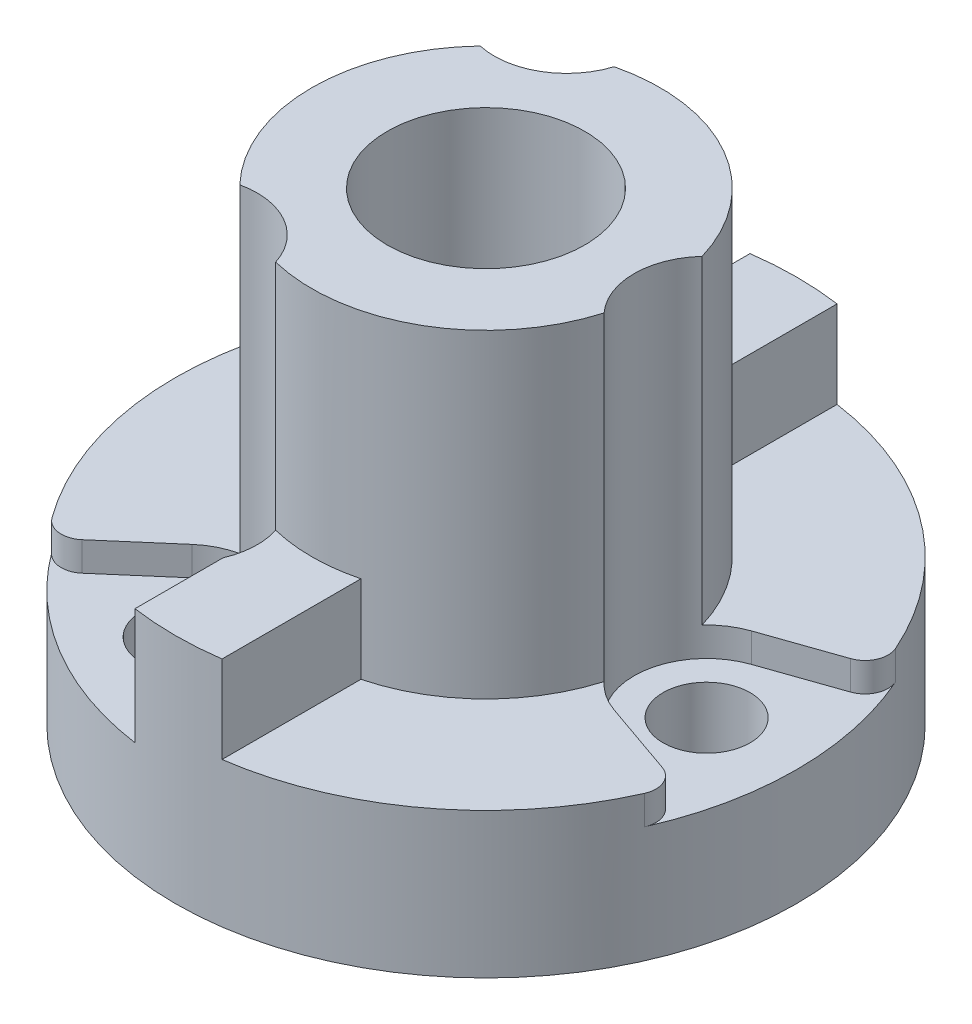
ISO-10303-21;
HEADER;
FILE_DESCRIPTION(('STEP AP214'),'2;1');
FILE_NAME('part.step','',(''),(''),'','','');
FILE_SCHEMA(('AUTOMOTIVE_DESIGN { 1 0 10303 214 1 1 1 1 }'));
ENDSEC;
DATA;
#1=APPLICATION_CONTEXT('core data for automotive mechanical design processes');
#2=APPLICATION_PROTOCOL_DEFINITION('international standard','automotive_design',2000,#1);
#3=PRODUCT_CONTEXT('',#1,'mechanical');
#4=PRODUCT('Part','Part','',(#3));
#5=PRODUCT_RELATED_PRODUCT_CATEGORY('part','',(#4));
#6=PRODUCT_DEFINITION_FORMATION('','',#4);
#7=PRODUCT_DEFINITION_CONTEXT('part definition',#1,'design');
#8=PRODUCT_DEFINITION('design','',#6,#7);
#9=PRODUCT_DEFINITION_SHAPE('','',#8);
#10=(LENGTH_UNIT() NAMED_UNIT(*) SI_UNIT(.MILLI.,.METRE.));
#11=(NAMED_UNIT(*) PLANE_ANGLE_UNIT() SI_UNIT($,.RADIAN.));
#12=(NAMED_UNIT(*) SI_UNIT($,.STERADIAN.) SOLID_ANGLE_UNIT());
#13=UNCERTAINTY_MEASURE_WITH_UNIT(LENGTH_MEASURE(1.E-05),#10,'distance_accuracy_value','');
#14=(GEOMETRIC_REPRESENTATION_CONTEXT(3) GLOBAL_UNCERTAINTY_ASSIGNED_CONTEXT((#13)) GLOBAL_UNIT_ASSIGNED_CONTEXT((#10,
#11,#12)) REPRESENTATION_CONTEXT('',''));
#15=CARTESIAN_POINT('',(0.,0.,0.));
#16=DIRECTION('',(0.,0.,1.));
#17=DIRECTION('',(1.,0.,0.));
#18=AXIS2_PLACEMENT_3D('',#15,#16,#17);
#19=CARTESIAN_POINT('',(-1.90000000000002,9.,3.29089653438086));
#20=DIRECTION('',(0.,-1.,0.));
#21=DIRECTION('',(0.,0.,-1.));
#22=AXIS2_PLACEMENT_3D('',#19,#20,#21);
#23=CYLINDRICAL_SURFACE('',#22,1.25);
#24=DIRECTION('',(0.,-1.,0.));
#25=VECTOR('',#24,1.);
#26=CARTESIAN_POINT('',(-0.707758125855996,5.5,2.91531789609381));
#27=LINE('',#26,#25);
#28=CARTESIAN_POINT('',(-0.707758125855994,4.,2.91531789609381));
#29=VERTEX_POINT('',#28);
#30=CARTESIAN_POINT('',(-0.707758125855995,8.,2.91531789609381));
#31=VERTEX_POINT('',#30);
#32=EDGE_CURVE('E509',#29,#31,#27,.F.);
#33=ORIENTED_EDGE('',*,*,#32,.T.);
#34=CARTESIAN_POINT('',(-1.90000000000002,8.,3.29089653438086));
#35=DIRECTION('',(0.,1.,0.));
#36=DIRECTION('',(0.,0.,1.));
#37=AXIS2_PLACEMENT_3D('',#34,#35,#36);
#38=CIRCLE('',#37,1.25);
#39=CARTESIAN_POINT('',(-2.17086029519666,8.,2.07059546477304));
#40=VERTEX_POINT('',#39);
#41=EDGE_CURVE('E217',#31,#40,#38,.T.);
#42=ORIENTED_EDGE('',*,*,#41,.T.);
#43=DIRECTION('',(0.,-1.,0.));
#44=VECTOR('',#43,1.);
#45=CARTESIAN_POINT('',(-2.17086029519666,5.5,2.07059546477304));
#46=LINE('',#45,#44);
#47=CARTESIAN_POINT('',(-2.17086029519666,2.5,2.07059546477304));
#48=VERTEX_POINT('',#47);
#49=EDGE_CURVE('E514',#40,#48,#46,.T.);
#50=ORIENTED_EDGE('',*,*,#49,.T.);
#51=CARTESIAN_POINT('',(-1.90000000000002,2.5,3.29089653438086));
#52=DIRECTION('',(0.,1.,0.));
#53=DIRECTION('',(0.,0.,1.));
#54=AXIS2_PLACEMENT_3D('',#51,#52,#53);
#55=CIRCLE('',#54,1.25);
#56=CARTESIAN_POINT('',(-2.71669486949511,2.5,2.34458290236429));
#57=VERTEX_POINT('',#56);
#58=EDGE_CURVE('E511',#57,#48,#55,.F.);
#59=ORIENTED_EDGE('',*,*,#58,.F.);
#60=DIRECTION('',(0.,1.,0.));
#61=VECTOR('',#60,1.);
#62=CARTESIAN_POINT('',(-2.71669486949511,-2.42823130797281,2.34458290236429));
#63=LINE('',#62,#61);
#64=CARTESIAN_POINT('',(-2.71669486949511,2.,2.34458290236429));
#65=VERTEX_POINT('',#64);
#66=EDGE_CURVE('E483',#65,#57,#63,.T.);
#67=ORIENTED_EDGE('',*,*,#66,.F.);
#68=CARTESIAN_POINT('',(-1.90000000000002,2.,3.29089653438086));
#69=DIRECTION('',(0.,1.,0.));
#70=DIRECTION('',(0.,0.,1.));
#71=AXIS2_PLACEMENT_3D('',#68,#69,#70);
#72=CIRCLE('',#71,1.25);
#73=CARTESIAN_POINT('',(-0.75,2.,3.78079448293746));
#74=VERTEX_POINT('',#73);
#75=EDGE_CURVE('E504',#74,#65,#72,.T.);
#76=ORIENTED_EDGE('',*,*,#75,.F.);
#77=DIRECTION('',(0.,-1.,0.));
#78=VECTOR('',#77,1.);
#79=CARTESIAN_POINT('',(-0.75,9.,3.78079448293746));
#80=LINE('',#79,#78);
#81=CARTESIAN_POINT('',(-0.75,4.,3.78079448293746));
#82=VERTEX_POINT('',#81);
#83=EDGE_CURVE('E335',#82,#74,#80,.T.);
#84=ORIENTED_EDGE('',*,*,#83,.F.);
#85=CARTESIAN_POINT('',(-1.90000000000002,4.,3.29089653438086));
#86=DIRECTION('',(0.,1.,0.));
#87=DIRECTION('',(0.,0.,1.));
#88=AXIS2_PLACEMENT_3D('',#85,#86,#87);
#89=CIRCLE('',#88,1.25);
#90=EDGE_CURVE('E307',#29,#82,#89,.F.);
#91=ORIENTED_EDGE('',*,*,#90,.F.);
#92=EDGE_LOOP('',(#33,#42,#50,#59,#67,#76,#84,#91));
#93=FACE_BOUND('',#92,.T.);
#94=ADVANCED_FACE('F42',(#93),#23,.F.);
#95=CARTESIAN_POINT('',(0.,12.5,0.));
#96=DIRECTION('',(0.,-1.,0.));
#97=DIRECTION('',(0.,0.,-1.));
#98=AXIS2_PLACEMENT_3D('',#95,#96,#97);
#99=CYLINDRICAL_SURFACE('',#98,3.);
#100=CARTESIAN_POINT('',(0.,8.,0.));
#101=DIRECTION('',(0.,1.,0.));
#102=DIRECTION('',(0.,0.,1.));
#103=AXIS2_PLACEMENT_3D('',#100,#101,#102);
#104=CIRCLE('',#103,3.);
#105=CARTESIAN_POINT('',(2.87861842105263,8.,-0.844722431320759));
#106=VERTEX_POINT('',#105);
#107=CARTESIAN_POINT('',(-0.707758125855956,8.,-2.91531789609382));
#108=VERTEX_POINT('',#107);
#109=EDGE_CURVE('E57',#106,#108,#104,.T.);
#110=ORIENTED_EDGE('',*,*,#109,.F.);
#111=DIRECTION('',(0.,-1.,0.));
#112=VECTOR('',#111,1.);
#113=CARTESIAN_POINT('',(2.87861842105263,5.5,-0.844722431320759));
#114=LINE('',#113,#112);
#115=CARTESIAN_POINT('',(2.87861842105263,2.5,-0.844722431320759));
#116=VERTEX_POINT('',#115);
#117=EDGE_CURVE('E231',#116,#106,#114,.F.);
#118=ORIENTED_EDGE('',*,*,#117,.F.);
#119=CARTESIAN_POINT('',(0.,2.5,0.));
#120=DIRECTION('',(0.,1.,0.));
#121=DIRECTION('',(0.,0.,1.));
#122=AXIS2_PLACEMENT_3D('',#119,#120,#121);
#123=CIRCLE('',#122,3.);
#124=CARTESIAN_POINT('',(0.750000000000001,2.5,-2.90473750965556));
#125=VERTEX_POINT('',#124);
#126=EDGE_CURVE('E370',#116,#125,#123,.T.);
#127=ORIENTED_EDGE('',*,*,#126,.T.);
#128=DIRECTION('',(0.,-1.,0.));
#129=VECTOR('',#128,1.);
#130=CARTESIAN_POINT('',(0.750000000000001,4.,-2.90473750965556));
#131=LINE('',#130,#129);
#132=CARTESIAN_POINT('',(0.750000000000001,4.,-2.90473750965556));
#133=VERTEX_POINT('',#132);
#134=EDGE_CURVE('E353',#133,#125,#131,.T.);
#135=ORIENTED_EDGE('',*,*,#134,.F.);
#136=CARTESIAN_POINT('',(0.,4.,0.));
#137=DIRECTION('',(0.,-1.,0.));
#138=DIRECTION('',(0.,0.,1.));
#139=AXIS2_PLACEMENT_3D('',#136,#137,#138);
#140=CIRCLE('',#139,3.);
#141=CARTESIAN_POINT('',(-0.707758125855955,4.,-2.91531789609382));
#142=VERTEX_POINT('',#141);
#143=EDGE_CURVE('E341',#142,#133,#140,.T.);
#144=ORIENTED_EDGE('',*,*,#143,.F.);
#145=DIRECTION('',(0.,-1.,0.));
#146=VECTOR('',#145,1.);
#147=CARTESIAN_POINT('',(-0.707758125855956,5.5,-2.91531789609382));
#148=LINE('',#147,#146);
#149=EDGE_CURVE('E351',#108,#142,#148,.T.);
#150=ORIENTED_EDGE('',*,*,#149,.F.);
#151=EDGE_LOOP('',(#110,#118,#127,#135,#144,#150));
#152=FACE_BOUND('',#151,.T.);
#153=ADVANCED_FACE('F350',(#152),#99,.T.);
#154=CARTESIAN_POINT('',(-2.17086029519663,8.,-2.07059546477307));
#155=VERTEX_POINT('',#154);
#156=EDGE_CURVE('E222',#155,#40,#104,.T.);
#157=ORIENTED_EDGE('',*,*,#156,.F.);
#158=DIRECTION('',(0.,-1.,0.));
#159=VECTOR('',#158,1.);
#160=CARTESIAN_POINT('',(-2.17086029519663,5.5,-2.07059546477307));
#161=LINE('',#160,#159);
#162=CARTESIAN_POINT('',(-2.17086029519663,2.5,-2.07059546477307));
#163=VERTEX_POINT('',#162);
#164=EDGE_CURVE('E522',#163,#155,#161,.F.);
#165=ORIENTED_EDGE('',*,*,#164,.F.);
#166=EDGE_CURVE('E324',#163,#48,#123,.T.);
#167=ORIENTED_EDGE('',*,*,#166,.T.);
#168=ORIENTED_EDGE('',*,*,#49,.F.);
#169=EDGE_LOOP('',(#157,#165,#167,#168));
#170=FACE_BOUND('',#169,.T.);
#171=ADVANCED_FACE('F411',(#170),#99,.T.);
#172=CARTESIAN_POINT('',(2.87861842105263,8.,0.844722431320759));
#173=VERTEX_POINT('',#172);
#174=EDGE_CURVE('E211',#31,#173,#104,.T.);
#175=ORIENTED_EDGE('',*,*,#174,.F.);
#176=ORIENTED_EDGE('',*,*,#32,.F.);
#177=CARTESIAN_POINT('',(0.,4.,0.));
#178=DIRECTION('',(0.,1.,0.));
#179=DIRECTION('',(0.,0.,-1.));
#180=AXIS2_PLACEMENT_3D('',#177,#178,#179);
#181=CIRCLE('',#180,3.);
#182=CARTESIAN_POINT('',(0.75,4.,2.90473750965556));
#183=VERTEX_POINT('',#182);
#184=EDGE_CURVE('E544',#29,#183,#181,.T.);
#185=ORIENTED_EDGE('',*,*,#184,.T.);
#186=DIRECTION('',(0.,-1.,0.));
#187=VECTOR('',#186,1.);
#188=CARTESIAN_POINT('',(0.750000000000001,4.,2.90473750965556));
#189=LINE('',#188,#187);
#190=CARTESIAN_POINT('',(0.750000000000001,2.5,2.90473750965556));
#191=VERTEX_POINT('',#190);
#192=EDGE_CURVE('E553',#183,#191,#189,.T.);
#193=ORIENTED_EDGE('',*,*,#192,.T.);
#194=CARTESIAN_POINT('',(2.87861842105263,2.5,0.844722431320759));
#195=VERTEX_POINT('',#194);
#196=EDGE_CURVE('E237',#191,#195,#123,.T.);
#197=ORIENTED_EDGE('',*,*,#196,.T.);
#198=DIRECTION('',(0.,-1.,0.));
#199=VECTOR('',#198,1.);
#200=CARTESIAN_POINT('',(2.87861842105263,5.5,0.844722431320759));
#201=LINE('',#200,#199);
#202=EDGE_CURVE('E228',#173,#195,#201,.T.);
#203=ORIENTED_EDGE('',*,*,#202,.F.);
#204=EDGE_LOOP('',(#175,#176,#185,#193,#197,#203));
#205=FACE_BOUND('',#204,.T.);
#206=ADVANCED_FACE('F235',(#205),#99,.T.);
#207=CARTESIAN_POINT('',(0.,0.,0.));
#208=DIRECTION('',(0.,1.,0.));
#209=DIRECTION('',(0.,0.,1.));
#210=AXIS2_PLACEMENT_3D('',#207,#208,#209);
#211=CYLINDRICAL_SURFACE('',#210,1.7);
#212=CARTESIAN_POINT('',(0.,0.,0.));
#213=DIRECTION('',(0.,1.,0.));
#214=DIRECTION('',(0.,0.,1.));
#215=AXIS2_PLACEMENT_3D('',#212,#213,#214);
#216=CIRCLE('',#215,1.7);
#217=CARTESIAN_POINT('',(0.,0.,1.7));
#218=VERTEX_POINT('',#217);
#219=EDGE_CURVE('E321',#218,#218,#216,.T.);
#220=ORIENTED_EDGE('',*,*,#219,.F.);
#221=EDGE_LOOP('',(#220));
#222=FACE_BOUND('',#221,.T.);
#223=CARTESIAN_POINT('',(0.,8.,0.));
#224=DIRECTION('',(0.,1.,0.));
#225=DIRECTION('',(0.,0.,1.));
#226=AXIS2_PLACEMENT_3D('',#223,#224,#225);
#227=CIRCLE('',#226,1.7);
#228=CARTESIAN_POINT('',(0.,8.,1.7));
#229=VERTEX_POINT('',#228);
#230=EDGE_CURVE('E232',#229,#229,#227,.F.);
#231=ORIENTED_EDGE('',*,*,#230,.F.);
#232=EDGE_LOOP('',(#231));
#233=FACE_BOUND('',#232,.T.);
#234=ADVANCED_FACE('F421',(#222,#233),#211,.F.);
#235=CARTESIAN_POINT('',(3.8,9.,0.));
#236=DIRECTION('',(0.,-1.,0.));
#237=DIRECTION('',(0.,0.,-1.));
#238=AXIS2_PLACEMENT_3D('',#235,#236,#237);
#239=CYLINDRICAL_SURFACE('',#238,1.25);
#240=ORIENTED_EDGE('',*,*,#117,.T.);
#241=CARTESIAN_POINT('',(3.8,8.,0.));
#242=DIRECTION('',(0.,1.,0.));
#243=DIRECTION('',(0.,0.,1.));
#244=AXIS2_PLACEMENT_3D('',#241,#242,#243);
#245=CIRCLE('',#244,1.25);
#246=EDGE_CURVE('E215',#106,#173,#245,.T.);
#247=ORIENTED_EDGE('',*,*,#246,.T.);
#248=ORIENTED_EDGE('',*,*,#202,.T.);
#249=CARTESIAN_POINT('',(3.8,2.5,0.));
#250=DIRECTION('',(0.,1.,0.));
#251=DIRECTION('',(0.,0.,1.));
#252=AXIS2_PLACEMENT_3D('',#249,#250,#251);
#253=CIRCLE('',#252,1.25);
#254=CARTESIAN_POINT('',(3.38881578947368,2.5,1.18043532013145));
#255=VERTEX_POINT('',#254);
#256=EDGE_CURVE('E525',#255,#195,#253,.F.);
#257=ORIENTED_EDGE('',*,*,#256,.F.);
#258=DIRECTION('',(0.,1.,0.));
#259=VECTOR('',#258,1.);
#260=CARTESIAN_POINT('',(3.38881578947368,-2.42823130797281,1.18043532013145));
#261=LINE('',#260,#259);
#262=CARTESIAN_POINT('',(3.38881578947368,2.,1.18043532013145));
#263=VERTEX_POINT('',#262);
#264=EDGE_CURVE('E490',#263,#255,#261,.T.);
#265=ORIENTED_EDGE('',*,*,#264,.F.);
#266=CARTESIAN_POINT('',(3.8,2.,0.));
#267=DIRECTION('',(0.,1.,0.));
#268=DIRECTION('',(0.,0.,1.));
#269=AXIS2_PLACEMENT_3D('',#266,#267,#268);
#270=CIRCLE('',#269,1.25);
#271=CARTESIAN_POINT('',(3.38881578947368,2.,-1.18043532013145));
#272=VERTEX_POINT('',#271);
#273=EDGE_CURVE('E478',#272,#263,#270,.T.);
#274=ORIENTED_EDGE('',*,*,#273,.F.);
#275=DIRECTION('',(0.,1.,0.));
#276=VECTOR('',#275,1.);
#277=CARTESIAN_POINT('',(3.38881578947368,-2.42823130797281,-1.18043532013145));
#278=LINE('',#277,#276);
#279=CARTESIAN_POINT('',(3.38881578947368,2.5,-1.18043532013145));
#280=VERTEX_POINT('',#279);
#281=EDGE_CURVE('E492',#272,#280,#278,.T.);
#282=ORIENTED_EDGE('',*,*,#281,.T.);
#283=EDGE_CURVE('E526',#116,#280,#253,.F.);
#284=ORIENTED_EDGE('',*,*,#283,.F.);
#285=EDGE_LOOP('',(#240,#247,#248,#257,#265,#274,#282,#284));
#286=FACE_BOUND('',#285,.T.);
#287=ADVANCED_FACE('F226',(#286),#239,.F.);
#288=CARTESIAN_POINT('',(-1.89999999999997,9.,-3.29089653438089));
#289=DIRECTION('',(0.,-1.,0.));
#290=DIRECTION('',(0.,0.,-1.));
#291=AXIS2_PLACEMENT_3D('',#288,#289,#290);
#292=CYLINDRICAL_SURFACE('',#291,1.25);
#293=ORIENTED_EDGE('',*,*,#164,.T.);
#294=CARTESIAN_POINT('',(-1.89999999999997,8.,-3.29089653438089));
#295=DIRECTION('',(0.,1.,0.));
#296=DIRECTION('',(0.,0.,1.));
#297=AXIS2_PLACEMENT_3D('',#294,#295,#296);
#298=CIRCLE('',#297,1.25);
#299=EDGE_CURVE('E11',#155,#108,#298,.T.);
#300=ORIENTED_EDGE('',*,*,#299,.T.);
#301=ORIENTED_EDGE('',*,*,#149,.T.);
#302=CARTESIAN_POINT('',(-1.89999999999997,4.,-3.29089653438089));
#303=DIRECTION('',(0.,1.,0.));
#304=DIRECTION('',(0.,0.,1.));
#305=AXIS2_PLACEMENT_3D('',#302,#303,#304);
#306=CIRCLE('',#305,1.25);
#307=CARTESIAN_POINT('',(-0.75,4.,-3.78079448293759));
#308=VERTEX_POINT('',#307);
#309=EDGE_CURVE('E243',#308,#142,#306,.F.);
#310=ORIENTED_EDGE('',*,*,#309,.F.);
#311=DIRECTION('',(0.,-1.,0.));
#312=VECTOR('',#311,1.);
#313=CARTESIAN_POINT('',(-0.75,9.,-3.78079448293759));
#314=LINE('',#313,#312);
#315=CARTESIAN_POINT('',(-0.75,2.,-3.78079448293759));
#316=VERTEX_POINT('',#315);
#317=EDGE_CURVE('E516',#308,#316,#314,.T.);
#318=ORIENTED_EDGE('',*,*,#317,.T.);
#319=CARTESIAN_POINT('',(-1.89999999999997,2.,-3.29089653438089));
#320=DIRECTION('',(0.,1.,0.));
#321=DIRECTION('',(0.,0.,1.));
#322=AXIS2_PLACEMENT_3D('',#319,#320,#321);
#323=CIRCLE('',#322,1.25);
#324=CARTESIAN_POINT('',(-2.71669486949508,2.,-2.34458290236433));
#325=VERTEX_POINT('',#324);
#326=EDGE_CURVE('E330',#325,#316,#323,.T.);
#327=ORIENTED_EDGE('',*,*,#326,.F.);
#328=DIRECTION('',(0.,1.,0.));
#329=VECTOR('',#328,1.);
#330=CARTESIAN_POINT('',(-2.71669486949508,-2.42823130797281,-2.34458290236433));
#331=LINE('',#330,#329);
#332=CARTESIAN_POINT('',(-2.71669486949508,2.5,-2.34458290236433));
#333=VERTEX_POINT('',#332);
#334=EDGE_CURVE('E468',#325,#333,#331,.T.);
#335=ORIENTED_EDGE('',*,*,#334,.T.);
#336=CARTESIAN_POINT('',(-1.89999999999997,2.5,-3.29089653438089));
#337=DIRECTION('',(0.,1.,0.));
#338=DIRECTION('',(0.,0.,1.));
#339=AXIS2_PLACEMENT_3D('',#336,#337,#338);
#340=CIRCLE('',#339,1.25);
#341=EDGE_CURVE('E519',#163,#333,#340,.F.);
#342=ORIENTED_EDGE('',*,*,#341,.F.);
#343=EDGE_LOOP('',(#293,#300,#301,#310,#318,#327,#335,#342));
#344=FACE_BOUND('',#343,.T.);
#345=ADVANCED_FACE('F386',(#344),#292,.F.);
#346=CARTESIAN_POINT('',(0.,2.5,0.));
#347=DIRECTION('',(0.,1.,0.));
#348=DIRECTION('',(0.,0.,1.));
#349=AXIS2_PLACEMENT_3D('',#346,#347,#348);
#350=PLANE('',#349);
#351=DIRECTION('',(-0.944348256105164,0.,0.328947368421053));
#352=VECTOR('',#351,1.);
#353=CARTESIAN_POINT('',(3.38881578947368,2.5,-1.18043532013145));
#354=LINE('',#353,#352);
#355=CARTESIAN_POINT('',(4.65923667667567,2.5,-1.62296444530378));
#356=VERTEX_POINT('',#355);
#357=EDGE_CURVE('E383',#356,#280,#354,.T.);
#358=ORIENTED_EDGE('',*,*,#357,.F.);
#359=CARTESIAN_POINT('',(4.52765772930725,2.5,-2.00070374774585));
#360=DIRECTION('',(0.,1.,0.));
#361=DIRECTION('',(0.,0.,1.));
#362=AXIS2_PLACEMENT_3D('',#359,#360,#361);
#363=CIRCLE('',#362,0.4);
#364=CARTESIAN_POINT('',(4.89352906096844,2.5,-2.16237677786673));
#365=VERTEX_POINT('',#364);
#366=EDGE_CURVE('E241',#356,#365,#363,.T.);
#367=ORIENTED_EDGE('',*,*,#366,.T.);
#368=CARTESIAN_POINT('',(0.,2.5,0.));
#369=DIRECTION('',(0.,1.,0.));
#370=DIRECTION('',(0.,0.,1.));
#371=AXIS2_PLACEMENT_3D('',#368,#369,#370);
#372=CIRCLE('',#371,5.35);
#373=CARTESIAN_POINT('',(0.75,2.5,-5.29716905525961));
#374=VERTEX_POINT('',#373);
#375=EDGE_CURVE('E310',#365,#374,#372,.T.);
#376=ORIENTED_EDGE('',*,*,#375,.T.);
#377=DIRECTION('',(0.,0.,-1.));
#378=VECTOR('',#377,1.);
#379=CARTESIAN_POINT('',(0.75,2.5,-5.29716905525961));
#380=LINE('',#379,#378);
#381=EDGE_CURVE('E362',#125,#374,#380,.T.);
#382=ORIENTED_EDGE('',*,*,#381,.F.);
#383=ORIENTED_EDGE('',*,*,#126,.F.);
#384=ORIENTED_EDGE('',*,*,#283,.T.);
#385=EDGE_LOOP('',(#358,#367,#376,#382,#383,#384));
#386=FACE_BOUND('',#385,.T.);
#387=ADVANCED_FACE('F382',(#386),#350,.T.);
#388=CARTESIAN_POINT('',(-0.75,4.,-5.29716905525961));
#389=DIRECTION('',(1.,0.,0.));
#390=DIRECTION('',(0.,0.,-1.));
#391=AXIS2_PLACEMENT_3D('',#388,#389,#390);
#392=PLANE('',#391);
#393=ORIENTED_EDGE('',*,*,#317,.F.);
#394=DIRECTION('',(0.,0.,1.));
#395=VECTOR('',#394,1.);
#396=CARTESIAN_POINT('',(-0.75,4.,-5.29716905525961));
#397=LINE('',#396,#395);
#398=CARTESIAN_POINT('',(-0.75,4.,-5.29716905525961));
#399=VERTEX_POINT('',#398);
#400=EDGE_CURVE('E344',#399,#308,#397,.T.);
#401=ORIENTED_EDGE('',*,*,#400,.F.);
#402=DIRECTION('',(0.,-1.,0.));
#403=VECTOR('',#402,1.);
#404=CARTESIAN_POINT('',(-0.75,4.,-5.29716905525961));
#405=LINE('',#404,#403);
#406=CARTESIAN_POINT('',(-0.75,2.,-5.29716905525961));
#407=VERTEX_POINT('',#406);
#408=EDGE_CURVE('E368',#399,#407,#405,.T.);
#409=ORIENTED_EDGE('',*,*,#408,.T.);
#410=DIRECTION('',(0.,0.,1.));
#411=VECTOR('',#410,1.);
#412=CARTESIAN_POINT('',(-0.75,2.,-5.29716905525961));
#413=LINE('',#412,#411);
#414=EDGE_CURVE('E464',#407,#316,#413,.T.);
#415=ORIENTED_EDGE('',*,*,#414,.T.);
#416=EDGE_LOOP('',(#393,#401,#409,#415));
#417=FACE_BOUND('',#416,.T.);
#418=ADVANCED_FACE('F385',(#417),#392,.F.);
#419=CARTESIAN_POINT('',(-0.75,4.,5.29716905525961));
#420=DIRECTION('',(-1.,0.,0.));
#421=DIRECTION('',(0.,0.,1.));
#422=AXIS2_PLACEMENT_3D('',#419,#420,#421);
#423=PLANE('',#422);
#424=DIRECTION('',(0.,0.,-1.));
#425=VECTOR('',#424,1.);
#426=CARTESIAN_POINT('',(-0.75,4.,5.29716905525961));
#427=LINE('',#426,#425);
#428=CARTESIAN_POINT('',(-0.75,4.,5.29716905525961));
#429=VERTEX_POINT('',#428);
#430=EDGE_CURVE('E546',#429,#82,#427,.T.);
#431=ORIENTED_EDGE('',*,*,#430,.T.);
#432=ORIENTED_EDGE('',*,*,#83,.T.);
#433=DIRECTION('',(0.,0.,1.));
#434=VECTOR('',#433,1.);
#435=CARTESIAN_POINT('',(-0.75,2.,3.78079448293746));
#436=LINE('',#435,#434);
#437=CARTESIAN_POINT('',(-0.75,2.,5.29716905525961));
#438=VERTEX_POINT('',#437);
#439=EDGE_CURVE('E479',#74,#438,#436,.T.);
#440=ORIENTED_EDGE('',*,*,#439,.T.);
#441=DIRECTION('',(0.,-1.,0.));
#442=VECTOR('',#441,1.);
#443=CARTESIAN_POINT('',(-0.75,4.,5.29716905525961));
#444=LINE('',#443,#442);
#445=EDGE_CURVE('E549',#429,#438,#444,.T.);
#446=ORIENTED_EDGE('',*,*,#445,.F.);
#447=EDGE_LOOP('',(#431,#432,#440,#446));
#448=FACE_BOUND('',#447,.T.);
#449=ADVANCED_FACE('F394',(#448),#423,.T.);
#450=CARTESIAN_POINT('',(-1.89999999999997,0.,-3.29089653438089));
#451=DIRECTION('',(0.,1.,0.));
#452=DIRECTION('',(0.,0.,1.));
#453=AXIS2_PLACEMENT_3D('',#450,#451,#452);
#454=CYLINDRICAL_SURFACE('',#453,0.75);
#455=CARTESIAN_POINT('',(-1.89999999999997,0.,-3.29089653438089));
#456=DIRECTION('',(0.,1.,0.));
#457=DIRECTION('',(0.,0.,1.));
#458=AXIS2_PLACEMENT_3D('',#455,#456,#457);
#459=CIRCLE('',#458,0.75);
#460=CARTESIAN_POINT('',(-1.89999999999997,0.,-2.54089653438088));
#461=VERTEX_POINT('',#460);
#462=EDGE_CURVE('E528',#461,#461,#459,.T.);
#463=ORIENTED_EDGE('',*,*,#462,.F.);
#464=EDGE_LOOP('',(#463));
#465=FACE_BOUND('',#464,.T.);
#466=CARTESIAN_POINT('',(-1.89999999999997,2.,-3.29089653438089));
#467=DIRECTION('',(0.,1.,0.));
#468=DIRECTION('',(0.,0.,1.));
#469=AXIS2_PLACEMENT_3D('',#466,#467,#468);
#470=CIRCLE('',#469,0.75);
#471=CARTESIAN_POINT('',(-1.89999999999997,2.,-2.54089653438088));
#472=VERTEX_POINT('',#471);
#473=EDGE_CURVE('E333',#472,#472,#470,.F.);
#474=ORIENTED_EDGE('',*,*,#473,.F.);
#475=EDGE_LOOP('',(#474));
#476=FACE_BOUND('',#475,.T.);
#477=ADVANCED_FACE('F432',(#465,#476),#454,.F.);
#478=CARTESIAN_POINT('',(-1.90000000000002,0.,3.29089653438086));
#479=DIRECTION('',(0.,1.,0.));
#480=DIRECTION('',(0.,0.,1.));
#481=AXIS2_PLACEMENT_3D('',#478,#479,#480);
#482=CYLINDRICAL_SURFACE('',#481,0.75);
#483=CARTESIAN_POINT('',(-1.90000000000002,0.,3.29089653438086));
#484=DIRECTION('',(0.,1.,0.));
#485=DIRECTION('',(0.,0.,1.));
#486=AXIS2_PLACEMENT_3D('',#483,#484,#485);
#487=CIRCLE('',#486,0.75);
#488=CARTESIAN_POINT('',(-1.90000000000002,0.,4.04089653438086));
#489=VERTEX_POINT('',#488);
#490=EDGE_CURVE('E533',#489,#489,#487,.T.);
#491=ORIENTED_EDGE('',*,*,#490,.F.);
#492=EDGE_LOOP('',(#491));
#493=FACE_BOUND('',#492,.T.);
#494=CARTESIAN_POINT('',(-1.90000000000002,2.,3.29089653438086));
#495=DIRECTION('',(0.,1.,0.));
#496=DIRECTION('',(0.,0.,1.));
#497=AXIS2_PLACEMENT_3D('',#494,#495,#496);
#498=CIRCLE('',#497,0.75);
#499=CARTESIAN_POINT('',(-1.90000000000002,2.,4.04089653438086));
#500=VERTEX_POINT('',#499);
#501=EDGE_CURVE('E329',#500,#500,#498,.F.);
#502=ORIENTED_EDGE('',*,*,#501,.F.);
#503=EDGE_LOOP('',(#502));
#504=FACE_BOUND('',#503,.T.);
#505=ADVANCED_FACE('F428',(#493,#504),#482,.F.);
#506=CARTESIAN_POINT('',(3.8,0.,0.));
#507=DIRECTION('',(0.,1.,0.));
#508=DIRECTION('',(0.,0.,1.));
#509=AXIS2_PLACEMENT_3D('',#506,#507,#508);
#510=CYLINDRICAL_SURFACE('',#509,0.75);
#511=CARTESIAN_POINT('',(3.8,0.,0.));
#512=DIRECTION('',(0.,1.,0.));
#513=DIRECTION('',(0.,0.,1.));
#514=AXIS2_PLACEMENT_3D('',#511,#512,#513);
#515=CIRCLE('',#514,0.75);
#516=CARTESIAN_POINT('',(3.8,0.,0.75));
#517=VERTEX_POINT('',#516);
#518=EDGE_CURVE('E529',#517,#517,#515,.T.);
#519=ORIENTED_EDGE('',*,*,#518,.F.);
#520=EDGE_LOOP('',(#519));
#521=FACE_BOUND('',#520,.T.);
#522=CARTESIAN_POINT('',(3.8,2.,0.));
#523=DIRECTION('',(0.,1.,0.));
#524=DIRECTION('',(0.,0.,1.));
#525=AXIS2_PLACEMENT_3D('',#522,#523,#524);
#526=CIRCLE('',#525,0.75);
#527=CARTESIAN_POINT('',(3.8,2.,0.75));
#528=VERTEX_POINT('',#527);
#529=EDGE_CURVE('E326',#528,#528,#526,.F.);
#530=ORIENTED_EDGE('',*,*,#529,.F.);
#531=EDGE_LOOP('',(#530));
#532=FACE_BOUND('',#531,.T.);
#533=ADVANCED_FACE('F401',(#521,#532),#510,.F.);
#534=CARTESIAN_POINT('',(0.75,2.5,5.29716905525961));
#535=VERTEX_POINT('',#534);
#536=CARTESIAN_POINT('',(4.89352906096845,2.5,2.16237677786673));
#537=VERTEX_POINT('',#536);
#538=EDGE_CURVE('E308',#535,#537,#372,.T.);
#539=ORIENTED_EDGE('',*,*,#538,.T.);
#540=CARTESIAN_POINT('',(4.52765772930725,2.5,2.00070374774585));
#541=DIRECTION('',(0.,1.,0.));
#542=DIRECTION('',(0.,0.,1.));
#543=AXIS2_PLACEMENT_3D('',#540,#541,#542);
#544=CIRCLE('',#543,0.4);
#545=CARTESIAN_POINT('',(4.65923667667567,2.5,1.62296444530378));
#546=VERTEX_POINT('',#545);
#547=EDGE_CURVE('E260',#537,#546,#544,.T.);
#548=ORIENTED_EDGE('',*,*,#547,.T.);
#549=DIRECTION('',(0.944348256105164,0.,0.328947368421052));
#550=VECTOR('',#549,1.);
#551=CARTESIAN_POINT('',(3.38881578947368,2.5,1.18043532013145));
#552=LINE('',#551,#550);
#553=EDGE_CURVE('E482',#255,#546,#552,.T.);
#554=ORIENTED_EDGE('',*,*,#553,.F.);
#555=ORIENTED_EDGE('',*,*,#256,.T.);
#556=ORIENTED_EDGE('',*,*,#196,.F.);
#557=DIRECTION('',(0.,0.,1.));
#558=VECTOR('',#557,1.);
#559=CARTESIAN_POINT('',(0.75,2.5,5.29716905525961));
#560=LINE('',#559,#558);
#561=EDGE_CURVE('E532',#191,#535,#560,.T.);
#562=ORIENTED_EDGE('',*,*,#561,.T.);
#563=EDGE_LOOP('',(#539,#548,#554,#555,#556,#562));
#564=FACE_BOUND('',#563,.T.);
#565=ADVANCED_FACE('F388',(#564),#350,.T.);
#566=CARTESIAN_POINT('',(-4.31943775267032,2.5,-3.15673209202276));
#567=VERTEX_POINT('',#566);
#568=CARTESIAN_POINT('',(-4.31943775267036,2.5,3.1567320920227));
#569=VERTEX_POINT('',#568);
#570=EDGE_CURVE('E300',#567,#569,#372,.T.);
#571=ORIENTED_EDGE('',*,*,#570,.T.);
#572=CARTESIAN_POINT('',(-3.99648913564828,2.5,2.9207147393481));
#573=DIRECTION('',(0.,1.,0.));
#574=DIRECTION('',(0.,0.,1.));
#575=AXIS2_PLACEMENT_3D('',#572,#573,#574);
#576=CIRCLE('',#575,0.4);
#577=CARTESIAN_POINT('',(-3.73514677740985,2.5,3.2235351015934));
#578=VERTEX_POINT('',#577);
#579=EDGE_CURVE('E266',#569,#578,#576,.T.);
#580=ORIENTED_EDGE('',*,*,#579,.T.);
#581=DIRECTION('',(-0.757050905613256,0.,0.653355895596075));
#582=VECTOR('',#581,1.);
#583=CARTESIAN_POINT('',(-4.05022234503092,2.5,3.495454041439));
#584=LINE('',#583,#582);
#585=EDGE_CURVE('E474',#57,#578,#584,.T.);
#586=ORIENTED_EDGE('',*,*,#585,.F.);
#587=ORIENTED_EDGE('',*,*,#58,.T.);
#588=ORIENTED_EDGE('',*,*,#166,.F.);
#589=ORIENTED_EDGE('',*,*,#341,.T.);
#590=DIRECTION('',(0.757050905613247,0.,0.653355895596085));
#591=VECTOR('',#590,1.);
#592=CARTESIAN_POINT('',(-2.71669486949508,2.5,-2.34458290236433));
#593=LINE('',#592,#591);
#594=CARTESIAN_POINT('',(-3.7351467774098,2.5,-3.22353510159346));
#595=VERTEX_POINT('',#594);
#596=EDGE_CURVE('E472',#595,#333,#593,.T.);
#597=ORIENTED_EDGE('',*,*,#596,.F.);
#598=CARTESIAN_POINT('',(-3.99648913564824,2.5,-2.92071473934816));
#599=DIRECTION('',(0.,1.,0.));
#600=DIRECTION('',(0.,0.,1.));
#601=AXIS2_PLACEMENT_3D('',#598,#599,#600);
#602=CIRCLE('',#601,0.4);
#603=EDGE_CURVE('E264',#595,#567,#602,.T.);
#604=ORIENTED_EDGE('',*,*,#603,.T.);
#605=EDGE_LOOP('',(#571,#580,#586,#587,#588,#589,#597,#604));
#606=FACE_BOUND('',#605,.T.);
#607=ADVANCED_FACE('F303',(#606),#350,.T.);
#608=CARTESIAN_POINT('',(0.,2.5,0.));
#609=DIRECTION('',(0.,-1.,0.));
#610=DIRECTION('',(0.,0.,-1.));
#611=AXIS2_PLACEMENT_3D('',#608,#609,#610);
#612=CYLINDRICAL_SURFACE('',#611,5.35);
#613=ORIENTED_EDGE('',*,*,#375,.F.);
#614=DIRECTION('',(0.,-1.,0.));
#615=VECTOR('',#614,1.);
#616=CARTESIAN_POINT('',(4.89352906096845,2.5,-2.16237677786673));
#617=LINE('',#616,#615);
#618=CARTESIAN_POINT('',(4.89352906096844,2.,-2.16237677786673));
#619=VERTEX_POINT('',#618);
#620=EDGE_CURVE('E257',#365,#619,#617,.T.);
#621=ORIENTED_EDGE('',*,*,#620,.T.);
#622=CARTESIAN_POINT('',(0.,2.,0.));
#623=DIRECTION('',(0.,1.,0.));
#624=DIRECTION('',(0.,0.,1.));
#625=AXIS2_PLACEMENT_3D('',#622,#623,#624);
#626=CIRCLE('',#625,5.35);
#627=CARTESIAN_POINT('',(4.89352906096844,2.,2.16237677786673));
#628=VERTEX_POINT('',#627);
#629=EDGE_CURVE('E495',#619,#628,#626,.F.);
#630=ORIENTED_EDGE('',*,*,#629,.T.);
#631=DIRECTION('',(0.,-1.,0.));
#632=VECTOR('',#631,1.);
#633=CARTESIAN_POINT('',(4.89352906096845,2.5,2.16237677786673));
#634=LINE('',#633,#632);
#635=EDGE_CURVE('E254',#628,#537,#634,.F.);
#636=ORIENTED_EDGE('',*,*,#635,.T.);
#637=ORIENTED_EDGE('',*,*,#538,.F.);
#638=DIRECTION('',(0.,-1.,0.));
#639=VECTOR('',#638,1.);
#640=CARTESIAN_POINT('',(0.75,4.,5.29716905525961));
#641=LINE('',#640,#639);
#642=CARTESIAN_POINT('',(0.75,4.,5.29716905525961));
#643=VERTEX_POINT('',#642);
#644=EDGE_CURVE('E364',#643,#535,#641,.T.);
#645=ORIENTED_EDGE('',*,*,#644,.F.);
#646=CARTESIAN_POINT('',(0.,4.,0.));
#647=DIRECTION('',(0.,-1.,0.));
#648=DIRECTION('',(0.,0.,-1.));
#649=AXIS2_PLACEMENT_3D('',#646,#647,#648);
#650=CIRCLE('',#649,5.35);
#651=EDGE_CURVE('E538',#643,#429,#650,.T.);
#652=ORIENTED_EDGE('',*,*,#651,.T.);
#653=ORIENTED_EDGE('',*,*,#445,.T.);
#654=CARTESIAN_POINT('',(0.,2.,0.));
#655=DIRECTION('',(0.,1.,0.));
#656=DIRECTION('',(0.,0.,1.));
#657=AXIS2_PLACEMENT_3D('',#654,#655,#656);
#658=CIRCLE('',#657,5.35);
#659=CARTESIAN_POINT('',(-4.31943775267036,2.,3.1567320920227));
#660=VERTEX_POINT('',#659);
#661=EDGE_CURVE('E289',#438,#660,#658,.F.);
#662=ORIENTED_EDGE('',*,*,#661,.T.);
#663=DIRECTION('',(0.,-1.,0.));
#664=VECTOR('',#663,1.);
#665=CARTESIAN_POINT('',(-4.31943775267036,2.5,3.1567320920227));
#666=LINE('',#665,#664);
#667=EDGE_CURVE('E251',#660,#569,#666,.F.);
#668=ORIENTED_EDGE('',*,*,#667,.T.);
#669=ORIENTED_EDGE('',*,*,#570,.F.);
#670=DIRECTION('',(0.,-1.,0.));
#671=VECTOR('',#670,1.);
#672=CARTESIAN_POINT('',(-4.31943775267032,2.5,-3.15673209202276));
#673=LINE('',#672,#671);
#674=CARTESIAN_POINT('',(-4.31943775267032,2.,-3.15673209202276));
#675=VERTEX_POINT('',#674);
#676=EDGE_CURVE('E248',#567,#675,#673,.T.);
#677=ORIENTED_EDGE('',*,*,#676,.T.);
#678=CARTESIAN_POINT('',(0.,2.,0.));
#679=DIRECTION('',(0.,1.,0.));
#680=DIRECTION('',(0.,0.,1.));
#681=AXIS2_PLACEMENT_3D('',#678,#679,#680);
#682=CIRCLE('',#681,5.35);
#683=EDGE_CURVE('E467',#675,#407,#682,.F.);
#684=ORIENTED_EDGE('',*,*,#683,.T.);
#685=ORIENTED_EDGE('',*,*,#408,.F.);
#686=CARTESIAN_POINT('',(0.,4.,0.));
#687=DIRECTION('',(0.,1.,0.));
#688=DIRECTION('',(0.,0.,1.));
#689=AXIS2_PLACEMENT_3D('',#686,#687,#688);
#690=CIRCLE('',#689,5.35);
#691=CARTESIAN_POINT('',(0.75,4.,-5.29716905525961));
#692=VERTEX_POINT('',#691);
#693=EDGE_CURVE('E358',#692,#399,#690,.T.);
#694=ORIENTED_EDGE('',*,*,#693,.F.);
#695=DIRECTION('',(0.,-1.,0.));
#696=VECTOR('',#695,1.);
#697=CARTESIAN_POINT('',(0.75,4.,-5.29716905525961));
#698=LINE('',#697,#696);
#699=EDGE_CURVE('E356',#692,#374,#698,.T.);
#700=ORIENTED_EDGE('',*,*,#699,.T.);
#701=EDGE_LOOP('',(#613,#621,#630,#636,#637,#645,#652,#653,#662,#668,#669,#677,#684,#685,#694,#700));
#702=FACE_BOUND('',#701,.T.);
#703=CARTESIAN_POINT('',(0.,0.,0.));
#704=DIRECTION('',(0.,1.,0.));
#705=DIRECTION('',(0.,0.,1.));
#706=AXIS2_PLACEMENT_3D('',#703,#704,#705);
#707=CIRCLE('',#706,5.35);
#708=CARTESIAN_POINT('',(0.,0.,5.35));
#709=VERTEX_POINT('',#708);
#710=EDGE_CURVE('E316',#709,#709,#707,.T.);
#711=ORIENTED_EDGE('',*,*,#710,.T.);
#712=EDGE_LOOP('',(#711));
#713=FACE_BOUND('',#712,.T.);
#714=ADVANCED_FACE('F298',(#702,#713),#612,.T.);
#715=CARTESIAN_POINT('',(0.,0.,0.));
#716=DIRECTION('',(0.,1.,0.));
#717=DIRECTION('',(0.,0.,1.));
#718=AXIS2_PLACEMENT_3D('',#715,#716,#717);
#719=PLANE('',#718);
#720=ORIENTED_EDGE('',*,*,#518,.T.);
#721=EDGE_LOOP('',(#720));
#722=FACE_BOUND('',#721,.T.);
#723=ORIENTED_EDGE('',*,*,#490,.T.);
#724=EDGE_LOOP('',(#723));
#725=FACE_BOUND('',#724,.T.);
#726=ORIENTED_EDGE('',*,*,#462,.T.);
#727=EDGE_LOOP('',(#726));
#728=FACE_BOUND('',#727,.T.);
#729=ORIENTED_EDGE('',*,*,#219,.T.);
#730=EDGE_LOOP('',(#729));
#731=FACE_BOUND('',#730,.T.);
#732=ORIENTED_EDGE('',*,*,#710,.F.);
#733=EDGE_LOOP('',(#732));
#734=FACE_BOUND('',#733,.T.);
#735=ADVANCED_FACE('F450',(#722,#725,#728,#731,#734),#719,.F.);
#736=CARTESIAN_POINT('',(0.75,4.,-5.29716905525961));
#737=DIRECTION('',(-1.,0.,0.));
#738=DIRECTION('',(0.,0.,1.));
#739=AXIS2_PLACEMENT_3D('',#736,#737,#738);
#740=PLANE('',#739);
#741=ORIENTED_EDGE('',*,*,#381,.T.);
#742=ORIENTED_EDGE('',*,*,#699,.F.);
#743=DIRECTION('',(0.,0.,-1.));
#744=VECTOR('',#743,1.);
#745=CARTESIAN_POINT('',(0.75,4.,-5.29716905525961));
#746=LINE('',#745,#744);
#747=EDGE_CURVE('E354',#133,#692,#746,.T.);
#748=ORIENTED_EDGE('',*,*,#747,.F.);
#749=ORIENTED_EDGE('',*,*,#134,.T.);
#750=EDGE_LOOP('',(#741,#742,#748,#749));
#751=FACE_BOUND('',#750,.T.);
#752=ADVANCED_FACE('F379',(#751),#740,.F.);
#753=CARTESIAN_POINT('',(0.,4.,0.));
#754=DIRECTION('',(0.,1.,0.));
#755=DIRECTION('',(0.,0.,1.));
#756=AXIS2_PLACEMENT_3D('',#753,#754,#755);
#757=PLANE('',#756);
#758=ORIENTED_EDGE('',*,*,#400,.T.);
#759=ORIENTED_EDGE('',*,*,#309,.T.);
#760=ORIENTED_EDGE('',*,*,#143,.T.);
#761=ORIENTED_EDGE('',*,*,#747,.T.);
#762=ORIENTED_EDGE('',*,*,#693,.T.);
#763=EDGE_LOOP('',(#758,#759,#760,#761,#762));
#764=FACE_BOUND('',#763,.T.);
#765=ADVANCED_FACE('F340',(#764),#757,.T.);
#766=CARTESIAN_POINT('',(0.75,4.,5.29716905525961));
#767=DIRECTION('',(1.,0.,0.));
#768=DIRECTION('',(0.,0.,-1.));
#769=AXIS2_PLACEMENT_3D('',#766,#767,#768);
#770=PLANE('',#769);
#771=ORIENTED_EDGE('',*,*,#561,.F.);
#772=ORIENTED_EDGE('',*,*,#192,.F.);
#773=DIRECTION('',(0.,0.,1.));
#774=VECTOR('',#773,1.);
#775=CARTESIAN_POINT('',(0.75,4.,5.29716905525961));
#776=LINE('',#775,#774);
#777=EDGE_CURVE('E541',#183,#643,#776,.T.);
#778=ORIENTED_EDGE('',*,*,#777,.T.);
#779=ORIENTED_EDGE('',*,*,#644,.T.);
#780=EDGE_LOOP('',(#771,#772,#778,#779));
#781=FACE_BOUND('',#780,.T.);
#782=ADVANCED_FACE('F439',(#781),#770,.T.);
#783=CARTESIAN_POINT('',(0.,4.,0.));
#784=DIRECTION('',(0.,1.,0.));
#785=DIRECTION('',(0.,0.,-1.));
#786=AXIS2_PLACEMENT_3D('',#783,#784,#785);
#787=PLANE('',#786);
#788=ORIENTED_EDGE('',*,*,#184,.F.);
#789=ORIENTED_EDGE('',*,*,#90,.T.);
#790=ORIENTED_EDGE('',*,*,#430,.F.);
#791=ORIENTED_EDGE('',*,*,#651,.F.);
#792=ORIENTED_EDGE('',*,*,#777,.F.);
#793=EDGE_LOOP('',(#788,#789,#790,#791,#792));
#794=FACE_BOUND('',#793,.T.);
#795=ADVANCED_FACE('F424',(#794),#787,.T.);
#796=CARTESIAN_POINT('',(3.8,2.,0.));
#797=DIRECTION('',(0.,1.,0.));
#798=DIRECTION('',(0.,0.,1.));
#799=AXIS2_PLACEMENT_3D('',#796,#797,#798);
#800=PLANE('',#799);
#801=ORIENTED_EDGE('',*,*,#273,.T.);
#802=DIRECTION('',(-0.944348256105164,0.,-0.328947368421053));
#803=VECTOR('',#802,1.);
#804=CARTESIAN_POINT('',(3.38881578947368,2.,1.18043532013145));
#805=LINE('',#804,#803);
#806=CARTESIAN_POINT('',(4.65923667667567,2.,1.62296444530378));
#807=VERTEX_POINT('',#806);
#808=EDGE_CURVE('E461',#807,#263,#805,.T.);
#809=ORIENTED_EDGE('',*,*,#808,.F.);
#810=CARTESIAN_POINT('',(4.52765772930725,2.,2.00070374774585));
#811=DIRECTION('',(0.,1.,0.));
#812=DIRECTION('',(0.,0.,1.));
#813=AXIS2_PLACEMENT_3D('',#810,#811,#812);
#814=CIRCLE('',#813,0.4);
#815=EDGE_CURVE('E275',#807,#628,#814,.F.);
#816=ORIENTED_EDGE('',*,*,#815,.T.);
#817=ORIENTED_EDGE('',*,*,#629,.F.);
#818=CARTESIAN_POINT('',(4.52765772930725,2.,-2.00070374774585));
#819=DIRECTION('',(0.,1.,0.));
#820=DIRECTION('',(0.,0.,1.));
#821=AXIS2_PLACEMENT_3D('',#818,#819,#820);
#822=CIRCLE('',#821,0.4);
#823=CARTESIAN_POINT('',(4.65923667667567,2.,-1.62296444530378));
#824=VERTEX_POINT('',#823);
#825=EDGE_CURVE('E273',#619,#824,#822,.F.);
#826=ORIENTED_EDGE('',*,*,#825,.T.);
#827=DIRECTION('',(0.944348256105164,0.,-0.328947368421053));
#828=VECTOR('',#827,1.);
#829=CARTESIAN_POINT('',(3.38881578947368,2.,-1.18043532013145));
#830=LINE('',#829,#828);
#831=EDGE_CURVE('E489',#272,#824,#830,.T.);
#832=ORIENTED_EDGE('',*,*,#831,.F.);
#833=EDGE_LOOP('',(#801,#809,#816,#817,#826,#832));
#834=FACE_BOUND('',#833,.T.);
#835=ORIENTED_EDGE('',*,*,#529,.T.);
#836=EDGE_LOOP('',(#835));
#837=FACE_BOUND('',#836,.T.);
#838=ADVANCED_FACE('F418',(#834,#837),#800,.T.);
#839=CARTESIAN_POINT('',(-1.90000000000002,2.,3.29089653438086));
#840=DIRECTION('',(0.,1.,0.));
#841=DIRECTION('',(0.,0.,1.));
#842=AXIS2_PLACEMENT_3D('',#839,#840,#841);
#843=PLANE('',#842);
#844=ORIENTED_EDGE('',*,*,#75,.T.);
#845=DIRECTION('',(0.757050905613256,0.,-0.653355895596075));
#846=VECTOR('',#845,1.);
#847=CARTESIAN_POINT('',(-4.05022234503092,2.,3.495454041439));
#848=LINE('',#847,#846);
#849=CARTESIAN_POINT('',(-3.73514677740985,2.,3.2235351015934));
#850=VERTEX_POINT('',#849);
#851=EDGE_CURVE('E290',#850,#65,#848,.T.);
#852=ORIENTED_EDGE('',*,*,#851,.F.);
#853=CARTESIAN_POINT('',(-3.99648913564828,2.,2.9207147393481));
#854=DIRECTION('',(0.,1.,0.));
#855=DIRECTION('',(0.,0.,1.));
#856=AXIS2_PLACEMENT_3D('',#853,#854,#855);
#857=CIRCLE('',#856,0.4);
#858=EDGE_CURVE('E278',#850,#660,#857,.F.);
#859=ORIENTED_EDGE('',*,*,#858,.T.);
#860=ORIENTED_EDGE('',*,*,#661,.F.);
#861=ORIENTED_EDGE('',*,*,#439,.F.);
#862=EDGE_LOOP('',(#844,#852,#859,#860,#861));
#863=FACE_BOUND('',#862,.T.);
#864=ORIENTED_EDGE('',*,*,#501,.T.);
#865=EDGE_LOOP('',(#864));
#866=FACE_BOUND('',#865,.T.);
#867=ADVANCED_FACE('F286',(#863,#866),#843,.T.);
#868=CARTESIAN_POINT('',(-1.89999999999997,2.,-3.29089653438089));
#869=DIRECTION('',(0.,1.,0.));
#870=DIRECTION('',(0.,0.,1.));
#871=AXIS2_PLACEMENT_3D('',#868,#869,#870);
#872=PLANE('',#871);
#873=ORIENTED_EDGE('',*,*,#326,.T.);
#874=ORIENTED_EDGE('',*,*,#414,.F.);
#875=ORIENTED_EDGE('',*,*,#683,.F.);
#876=CARTESIAN_POINT('',(-3.99648913564824,2.,-2.92071473934816));
#877=DIRECTION('',(0.,1.,0.));
#878=DIRECTION('',(0.,0.,1.));
#879=AXIS2_PLACEMENT_3D('',#876,#877,#878);
#880=CIRCLE('',#879,0.4);
#881=CARTESIAN_POINT('',(-3.7351467774098,2.,-3.22353510159346));
#882=VERTEX_POINT('',#881);
#883=EDGE_CURVE('E50',#675,#882,#880,.F.);
#884=ORIENTED_EDGE('',*,*,#883,.T.);
#885=DIRECTION('',(-0.757050905613247,0.,-0.653355895596085));
#886=VECTOR('',#885,1.);
#887=CARTESIAN_POINT('',(-2.71669486949508,2.,-2.34458290236433));
#888=LINE('',#887,#886);
#889=EDGE_CURVE('E471',#325,#882,#888,.T.);
#890=ORIENTED_EDGE('',*,*,#889,.F.);
#891=EDGE_LOOP('',(#873,#874,#875,#884,#890));
#892=FACE_BOUND('',#891,.T.);
#893=ORIENTED_EDGE('',*,*,#473,.T.);
#894=EDGE_LOOP('',(#893));
#895=FACE_BOUND('',#894,.T.);
#896=ADVANCED_FACE('F417',(#892,#895),#872,.T.);
#897=CARTESIAN_POINT('',(-2.71669486949508,-2.42823130797281,-2.34458290236433));
#898=DIRECTION('',(-0.653355895596085,0.,0.757050905613247));
#899=DIRECTION('',(0.757050905613247,0.,0.653355895596085));
#900=AXIS2_PLACEMENT_3D('',#897,#898,#899);
#901=PLANE('',#900);
#902=ORIENTED_EDGE('',*,*,#889,.T.);
#903=DIRECTION('',(0.,-1.,0.));
#904=VECTOR('',#903,1.);
#905=CARTESIAN_POINT('',(-3.7351467774098,-2.42823130797281,-3.22353510159346));
#906=LINE('',#905,#904);
#907=EDGE_CURVE('E270',#882,#595,#906,.F.);
#908=ORIENTED_EDGE('',*,*,#907,.T.);
#909=ORIENTED_EDGE('',*,*,#596,.T.);
#910=ORIENTED_EDGE('',*,*,#334,.F.);
#911=EDGE_LOOP('',(#902,#908,#909,#910));
#912=FACE_BOUND('',#911,.T.);
#913=ADVANCED_FACE('F652',(#912),#901,.F.);
#914=CARTESIAN_POINT('',(-4.05022234503092,-2.42823130797281,3.495454041439));
#915=DIRECTION('',(-0.653355895596075,0.,-0.757050905613256));
#916=DIRECTION('',(-0.757050905613256,0.,0.653355895596075));
#917=AXIS2_PLACEMENT_3D('',#914,#915,#916);
#918=PLANE('',#917);
#919=ORIENTED_EDGE('',*,*,#585,.T.);
#920=DIRECTION('',(0.,-1.,0.));
#921=VECTOR('',#920,1.);
#922=CARTESIAN_POINT('',(-3.73514677740985,-2.42823130797281,3.2235351015934));
#923=LINE('',#922,#921);
#924=EDGE_CURVE('E268',#578,#850,#923,.T.);
#925=ORIENTED_EDGE('',*,*,#924,.T.);
#926=ORIENTED_EDGE('',*,*,#851,.T.);
#927=ORIENTED_EDGE('',*,*,#66,.T.);
#928=EDGE_LOOP('',(#919,#925,#926,#927));
#929=FACE_BOUND('',#928,.T.);
#930=ADVANCED_FACE('F643',(#929),#918,.F.);
#931=CARTESIAN_POINT('',(3.38881578947368,-2.42823130797281,-1.18043532013145));
#932=DIRECTION('',(-0.328947368421053,0.,-0.944348256105164));
#933=DIRECTION('',(-0.944348256105164,0.,0.328947368421053));
#934=AXIS2_PLACEMENT_3D('',#931,#932,#933);
#935=PLANE('',#934);
#936=ORIENTED_EDGE('',*,*,#831,.T.);
#937=DIRECTION('',(0.,-1.,0.));
#938=VECTOR('',#937,1.);
#939=CARTESIAN_POINT('',(4.65923667667567,-2.42823130797281,-1.62296444530378));
#940=LINE('',#939,#938);
#941=EDGE_CURVE('E238',#824,#356,#940,.F.);
#942=ORIENTED_EDGE('',*,*,#941,.T.);
#943=ORIENTED_EDGE('',*,*,#357,.T.);
#944=ORIENTED_EDGE('',*,*,#281,.F.);
#945=EDGE_LOOP('',(#936,#942,#943,#944));
#946=FACE_BOUND('',#945,.T.);
#947=ADVANCED_FACE('F634',(#946),#935,.F.);
#948=CARTESIAN_POINT('',(3.38881578947368,-2.42823130797281,1.18043532013145));
#949=DIRECTION('',(-0.328947368421052,0.,0.944348256105164));
#950=DIRECTION('',(0.944348256105164,0.,0.328947368421053));
#951=AXIS2_PLACEMENT_3D('',#948,#949,#950);
#952=PLANE('',#951);
#953=ORIENTED_EDGE('',*,*,#553,.T.);
#954=DIRECTION('',(0.,-1.,0.));
#955=VECTOR('',#954,1.);
#956=CARTESIAN_POINT('',(4.65923667667567,-2.42823130797281,1.62296444530378));
#957=LINE('',#956,#955);
#958=EDGE_CURVE('E262',#546,#807,#957,.T.);
#959=ORIENTED_EDGE('',*,*,#958,.T.);
#960=ORIENTED_EDGE('',*,*,#808,.T.);
#961=ORIENTED_EDGE('',*,*,#264,.T.);
#962=EDGE_LOOP('',(#953,#959,#960,#961));
#963=FACE_BOUND('',#962,.T.);
#964=ADVANCED_FACE('F625',(#963),#952,.F.);
#965=CARTESIAN_POINT('',(4.52765772930725,2.5,-2.00070374774585));
#966=DIRECTION('',(0.,-1.,0.));
#967=DIRECTION('',(0.,0.,-1.));
#968=AXIS2_PLACEMENT_3D('',#965,#966,#967);
#969=CYLINDRICAL_SURFACE('',#968,0.4);
#970=ORIENTED_EDGE('',*,*,#825,.F.);
#971=ORIENTED_EDGE('',*,*,#620,.F.);
#972=ORIENTED_EDGE('',*,*,#366,.F.);
#973=ORIENTED_EDGE('',*,*,#941,.F.);
#974=EDGE_LOOP('',(#970,#971,#972,#973));
#975=FACE_BOUND('',#974,.T.);
#976=ADVANCED_FACE('F616',(#975),#969,.T.);
#977=CARTESIAN_POINT('',(4.52765772930725,2.5,2.00070374774585));
#978=DIRECTION('',(0.,-1.,0.));
#979=DIRECTION('',(0.,0.,-1.));
#980=AXIS2_PLACEMENT_3D('',#977,#978,#979);
#981=CYLINDRICAL_SURFACE('',#980,0.4);
#982=ORIENTED_EDGE('',*,*,#815,.F.);
#983=ORIENTED_EDGE('',*,*,#958,.F.);
#984=ORIENTED_EDGE('',*,*,#547,.F.);
#985=ORIENTED_EDGE('',*,*,#635,.F.);
#986=EDGE_LOOP('',(#982,#983,#984,#985));
#987=FACE_BOUND('',#986,.T.);
#988=ADVANCED_FACE('F609',(#987),#981,.T.);
#989=CARTESIAN_POINT('',(-3.99648913564828,2.5,2.9207147393481));
#990=DIRECTION('',(0.,-1.,0.));
#991=DIRECTION('',(0.,0.,-1.));
#992=AXIS2_PLACEMENT_3D('',#989,#990,#991);
#993=CYLINDRICAL_SURFACE('',#992,0.4);
#994=ORIENTED_EDGE('',*,*,#858,.F.);
#995=ORIENTED_EDGE('',*,*,#924,.F.);
#996=ORIENTED_EDGE('',*,*,#579,.F.);
#997=ORIENTED_EDGE('',*,*,#667,.F.);
#998=EDGE_LOOP('',(#994,#995,#996,#997));
#999=FACE_BOUND('',#998,.T.);
#1000=ADVANCED_FACE('F293',(#999),#993,.T.);
#1001=CARTESIAN_POINT('',(-3.99648913564824,2.5,-2.92071473934816));
#1002=DIRECTION('',(0.,-1.,0.));
#1003=DIRECTION('',(0.,0.,-1.));
#1004=AXIS2_PLACEMENT_3D('',#1001,#1002,#1003);
#1005=CYLINDRICAL_SURFACE('',#1004,0.4);
#1006=ORIENTED_EDGE('',*,*,#883,.F.);
#1007=ORIENTED_EDGE('',*,*,#676,.F.);
#1008=ORIENTED_EDGE('',*,*,#603,.F.);
#1009=ORIENTED_EDGE('',*,*,#907,.F.);
#1010=EDGE_LOOP('',(#1006,#1007,#1008,#1009));
#1011=FACE_BOUND('',#1010,.T.);
#1012=ADVANCED_FACE('F44',(#1011),#1005,.T.);
#1013=CARTESIAN_POINT('',(0.,8.,0.));
#1014=DIRECTION('',(0.,1.,0.));
#1015=DIRECTION('',(0.,0.,1.));
#1016=AXIS2_PLACEMENT_3D('',#1013,#1014,#1015);
#1017=PLANE('',#1016);
#1018=ORIENTED_EDGE('',*,*,#174,.T.);
#1019=ORIENTED_EDGE('',*,*,#246,.F.);
#1020=ORIENTED_EDGE('',*,*,#109,.T.);
#1021=ORIENTED_EDGE('',*,*,#299,.F.);
#1022=ORIENTED_EDGE('',*,*,#156,.T.);
#1023=ORIENTED_EDGE('',*,*,#41,.F.);
#1024=EDGE_LOOP('',(#1018,#1019,#1020,#1021,#1022,#1023));
#1025=FACE_BOUND('',#1024,.T.);
#1026=ORIENTED_EDGE('',*,*,#230,.T.);
#1027=EDGE_LOOP('',(#1026));
#1028=FACE_BOUND('',#1027,.T.);
#1029=ADVANCED_FACE('F213',(#1025,#1028),#1017,.T.);
#1030=CLOSED_SHELL('',(#94,#153,#171,#206,#234,#287,#345,#387,#418,#449,#477,#505,#533,#565,
#607,#714,#735,#752,#765,#782,#795,#838,#867,#896,#913,#930,#947,#964,#976,#988,#1000,#1012,#1029));
#1031=MANIFOLD_SOLID_BREP('B2',#1030);
#1032=ADVANCED_BREP_SHAPE_REPRESENTATION('',(#18,#1031),#14);
#1033=SHAPE_DEFINITION_REPRESENTATION(#9,#1032);
ENDSEC;
END-ISO-10303-21;
